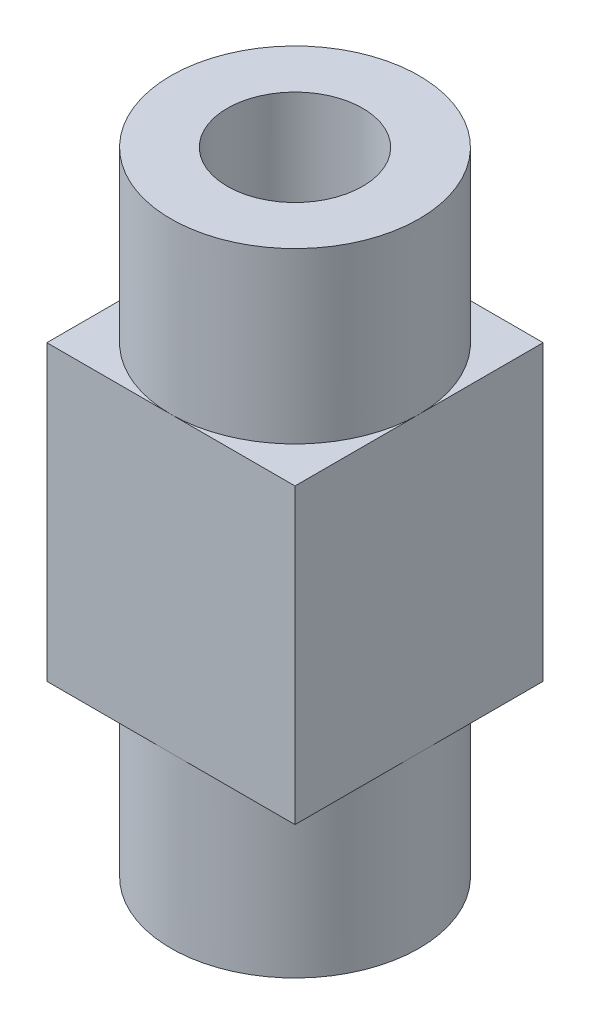
ISO-10303-21;
HEADER;
FILE_DESCRIPTION(('STEP AP214'),'2;1');
FILE_NAME('part.step','',(''),(''),'','','');
FILE_SCHEMA(('AUTOMOTIVE_DESIGN { 1 0 10303 214 1 1 1 1 }'));
ENDSEC;
DATA;
#1=APPLICATION_CONTEXT('core data for automotive mechanical design processes');
#2=APPLICATION_PROTOCOL_DEFINITION('international standard','automotive_design',2000,#1);
#3=PRODUCT_CONTEXT('',#1,'mechanical');
#4=PRODUCT('Part','Part','',(#3));
#5=PRODUCT_RELATED_PRODUCT_CATEGORY('part','',(#4));
#6=PRODUCT_DEFINITION_FORMATION('','',#4);
#7=PRODUCT_DEFINITION_CONTEXT('part definition',#1,'design');
#8=PRODUCT_DEFINITION('design','',#6,#7);
#9=PRODUCT_DEFINITION_SHAPE('','',#8);
#10=(LENGTH_UNIT() NAMED_UNIT(*) SI_UNIT(.MILLI.,.METRE.));
#11=(NAMED_UNIT(*) PLANE_ANGLE_UNIT() SI_UNIT($,.RADIAN.));
#12=(NAMED_UNIT(*) SI_UNIT($,.STERADIAN.) SOLID_ANGLE_UNIT());
#13=UNCERTAINTY_MEASURE_WITH_UNIT(LENGTH_MEASURE(1.E-05),#10,'distance_accuracy_value','');
#14=(GEOMETRIC_REPRESENTATION_CONTEXT(3) GLOBAL_UNCERTAINTY_ASSIGNED_CONTEXT((#13)) GLOBAL_UNIT_ASSIGNED_CONTEXT((#10,
#11,#12)) REPRESENTATION_CONTEXT('',''));
#15=CARTESIAN_POINT('',(0.,0.,0.));
#16=DIRECTION('',(0.,0.,1.));
#17=DIRECTION('',(1.,0.,0.));
#18=AXIS2_PLACEMENT_3D('',#15,#16,#17);
#19=CARTESIAN_POINT('',(-11.,41.,-11.));
#20=DIRECTION('',(0.,1.,0.));
#21=DIRECTION('',(0.,0.,1.));
#22=AXIS2_PLACEMENT_3D('',#19,#20,#21);
#23=PLANE('',#22);
#24=DIRECTION('',(0.,0.,-1.));
#25=VECTOR('',#24,1.);
#26=CARTESIAN_POINT('',(11.,41.,11.));
#27=LINE('',#26,#25);
#28=CARTESIAN_POINT('',(11.,41.,11.));
#29=VERTEX_POINT('',#28);
#30=CARTESIAN_POINT('',(11.,41.,0.));
#31=VERTEX_POINT('',#30);
#32=EDGE_CURVE('E142',#29,#31,#27,.T.);
#33=ORIENTED_EDGE('',*,*,#32,.T.);
#34=CARTESIAN_POINT('',(0.,41.,0.));
#35=DIRECTION('',(0.,-1.,0.));
#36=DIRECTION('',(1.,0.,0.));
#37=AXIS2_PLACEMENT_3D('',#34,#35,#36);
#38=CIRCLE('',#37,11.);
#39=CARTESIAN_POINT('',(0.,41.,11.));
#40=VERTEX_POINT('',#39);
#41=EDGE_CURVE('E79',#31,#40,#38,.T.);
#42=ORIENTED_EDGE('',*,*,#41,.T.);
#43=DIRECTION('',(1.,0.,0.));
#44=VECTOR('',#43,1.);
#45=CARTESIAN_POINT('',(-11.,41.,11.));
#46=LINE('',#45,#44);
#47=EDGE_CURVE('E139',#40,#29,#46,.T.);
#48=ORIENTED_EDGE('',*,*,#47,.T.);
#49=EDGE_LOOP('',(#33,#42,#48));
#50=FACE_BOUND('',#49,.T.);
#51=ADVANCED_FACE('F63',(#50),#23,.T.);
#52=CARTESIAN_POINT('',(-11.,41.,11.));
#53=VERTEX_POINT('',#52);
#54=EDGE_CURVE('E151',#53,#40,#46,.T.);
#55=ORIENTED_EDGE('',*,*,#54,.T.);
#56=CARTESIAN_POINT('',(-11.,41.,0.));
#57=VERTEX_POINT('',#56);
#58=EDGE_CURVE('E127',#40,#57,#38,.T.);
#59=ORIENTED_EDGE('',*,*,#58,.T.);
#60=DIRECTION('',(0.,0.,1.));
#61=VECTOR('',#60,1.);
#62=CARTESIAN_POINT('',(-11.,41.,-11.));
#63=LINE('',#62,#61);
#64=EDGE_CURVE('E156',#57,#53,#63,.T.);
#65=ORIENTED_EDGE('',*,*,#64,.T.);
#66=EDGE_LOOP('',(#55,#59,#65));
#67=FACE_BOUND('',#66,.T.);
#68=ADVANCED_FACE('F155',(#67),#23,.T.);
#69=CARTESIAN_POINT('',(-11.,41.,-11.));
#70=VERTEX_POINT('',#69);
#71=EDGE_CURVE('E153',#70,#57,#63,.T.);
#72=ORIENTED_EDGE('',*,*,#71,.T.);
#73=CARTESIAN_POINT('',(0.,41.,-11.));
#74=VERTEX_POINT('',#73);
#75=EDGE_CURVE('E130',#57,#74,#38,.T.);
#76=ORIENTED_EDGE('',*,*,#75,.T.);
#77=DIRECTION('',(-1.,0.,0.));
#78=VECTOR('',#77,1.);
#79=CARTESIAN_POINT('',(11.,41.,-11.));
#80=LINE('',#79,#78);
#81=EDGE_CURVE('E162',#74,#70,#80,.T.);
#82=ORIENTED_EDGE('',*,*,#81,.T.);
#83=EDGE_LOOP('',(#72,#76,#82));
#84=FACE_BOUND('',#83,.T.);
#85=ADVANCED_FACE('F259',(#84),#23,.T.);
#86=CARTESIAN_POINT('',(11.,41.,-11.));
#87=VERTEX_POINT('',#86);
#88=EDGE_CURVE('E163',#87,#74,#80,.T.);
#89=ORIENTED_EDGE('',*,*,#88,.T.);
#90=EDGE_CURVE('E146',#74,#31,#38,.T.);
#91=ORIENTED_EDGE('',*,*,#90,.T.);
#92=EDGE_CURVE('E158',#31,#87,#27,.T.);
#93=ORIENTED_EDGE('',*,*,#92,.T.);
#94=EDGE_LOOP('',(#89,#91,#93));
#95=FACE_BOUND('',#94,.T.);
#96=ADVANCED_FACE('F255',(#95),#23,.T.);
#97=CARTESIAN_POINT('',(0.,15.,0.));
#98=DIRECTION('',(0.,-1.,0.));
#99=DIRECTION('',(0.,0.,-1.));
#100=AXIS2_PLACEMENT_3D('',#97,#98,#99);
#101=CYLINDRICAL_SURFACE('',#100,11.);
#102=CARTESIAN_POINT('',(0.,15.,0.));
#103=DIRECTION('',(0.,-1.,0.));
#104=DIRECTION('',(1.,0.,0.));
#105=AXIS2_PLACEMENT_3D('',#102,#103,#104);
#106=CIRCLE('',#105,11.);
#107=CARTESIAN_POINT('',(11.,15.,0.));
#108=VERTEX_POINT('',#107);
#109=CARTESIAN_POINT('',(0.,15.,11.));
#110=VERTEX_POINT('',#109);
#111=EDGE_CURVE('E194',#108,#110,#106,.T.);
#112=ORIENTED_EDGE('',*,*,#111,.T.);
#113=CARTESIAN_POINT('',(-11.,15.,0.));
#114=VERTEX_POINT('',#113);
#115=EDGE_CURVE('E196',#110,#114,#106,.T.);
#116=ORIENTED_EDGE('',*,*,#115,.T.);
#117=CARTESIAN_POINT('',(0.,15.,-11.));
#118=VERTEX_POINT('',#117);
#119=EDGE_CURVE('E204',#114,#118,#106,.T.);
#120=ORIENTED_EDGE('',*,*,#119,.T.);
#121=EDGE_CURVE('E197',#118,#108,#106,.T.);
#122=ORIENTED_EDGE('',*,*,#121,.T.);
#123=EDGE_LOOP('',(#112,#116,#120,#122));
#124=FACE_BOUND('',#123,.T.);
#125=CARTESIAN_POINT('',(0.,0.,0.));
#126=DIRECTION('',(0.,-1.,0.));
#127=DIRECTION('',(1.,0.,0.));
#128=AXIS2_PLACEMENT_3D('',#125,#126,#127);
#129=CIRCLE('',#128,11.);
#130=CARTESIAN_POINT('',(11.,0.,0.));
#131=VERTEX_POINT('',#130);
#132=EDGE_CURVE('E193',#131,#131,#129,.T.);
#133=ORIENTED_EDGE('',*,*,#132,.F.);
#134=EDGE_LOOP('',(#133));
#135=FACE_BOUND('',#134,.T.);
#136=ADVANCED_FACE('F65',(#124,#135),#101,.T.);
#137=CARTESIAN_POINT('',(0.,0.,0.));
#138=DIRECTION('',(0.,-1.,0.));
#139=DIRECTION('',(0.,0.,-1.));
#140=AXIS2_PLACEMENT_3D('',#137,#138,#139);
#141=PLANE('',#140);
#142=ORIENTED_EDGE('',*,*,#132,.T.);
#143=EDGE_LOOP('',(#142));
#144=FACE_BOUND('',#143,.T.);
#145=CARTESIAN_POINT('',(0.,0.,0.));
#146=DIRECTION('',(0.,-1.,0.));
#147=DIRECTION('',(0.,0.,-1.));
#148=AXIS2_PLACEMENT_3D('',#145,#146,#147);
#149=CIRCLE('',#148,6.);
#150=CARTESIAN_POINT('',(0.,0.,-6.));
#151=VERTEX_POINT('',#150);
#152=EDGE_CURVE('E145',#151,#151,#149,.F.);
#153=ORIENTED_EDGE('',*,*,#152,.T.);
#154=EDGE_LOOP('',(#153));
#155=FACE_BOUND('',#154,.T.);
#156=ADVANCED_FACE('F268',(#144,#155),#141,.T.);
#157=CARTESIAN_POINT('',(-11.,15.,-11.));
#158=DIRECTION('',(0.,1.,0.));
#159=DIRECTION('',(0.,0.,1.));
#160=AXIS2_PLACEMENT_3D('',#157,#158,#159);
#161=PLANE('',#160);
#162=ORIENTED_EDGE('',*,*,#111,.F.);
#163=DIRECTION('',(0.,0.,-1.));
#164=VECTOR('',#163,1.);
#165=CARTESIAN_POINT('',(11.,15.,0.));
#166=LINE('',#165,#164);
#167=CARTESIAN_POINT('',(11.,15.,11.));
#168=VERTEX_POINT('',#167);
#169=EDGE_CURVE('E87',#168,#108,#166,.T.);
#170=ORIENTED_EDGE('',*,*,#169,.F.);
#171=DIRECTION('',(1.,0.,0.));
#172=VECTOR('',#171,1.);
#173=CARTESIAN_POINT('',(0.,15.,11.));
#174=LINE('',#173,#172);
#175=EDGE_CURVE('E171',#110,#168,#174,.T.);
#176=ORIENTED_EDGE('',*,*,#175,.F.);
#177=EDGE_LOOP('',(#162,#170,#176));
#178=FACE_BOUND('',#177,.T.);
#179=ADVANCED_FACE('F217',(#178),#161,.F.);
#180=ORIENTED_EDGE('',*,*,#115,.F.);
#181=CARTESIAN_POINT('',(-11.,15.,11.));
#182=VERTEX_POINT('',#181);
#183=EDGE_CURVE('E173',#182,#110,#174,.T.);
#184=ORIENTED_EDGE('',*,*,#183,.F.);
#185=DIRECTION('',(0.,0.,1.));
#186=VECTOR('',#185,1.);
#187=CARTESIAN_POINT('',(-11.,15.,0.));
#188=LINE('',#187,#186);
#189=EDGE_CURVE('E172',#114,#182,#188,.T.);
#190=ORIENTED_EDGE('',*,*,#189,.F.);
#191=EDGE_LOOP('',(#180,#184,#190));
#192=FACE_BOUND('',#191,.T.);
#193=ADVANCED_FACE('F214',(#192),#161,.F.);
#194=ORIENTED_EDGE('',*,*,#119,.F.);
#195=CARTESIAN_POINT('',(-11.,15.,-11.));
#196=VERTEX_POINT('',#195);
#197=EDGE_CURVE('E167',#196,#114,#188,.T.);
#198=ORIENTED_EDGE('',*,*,#197,.F.);
#199=DIRECTION('',(-1.,0.,0.));
#200=VECTOR('',#199,1.);
#201=CARTESIAN_POINT('',(11.,15.,-11.));
#202=LINE('',#201,#200);
#203=EDGE_CURVE('E180',#118,#196,#202,.T.);
#204=ORIENTED_EDGE('',*,*,#203,.F.);
#205=EDGE_LOOP('',(#194,#198,#204));
#206=FACE_BOUND('',#205,.T.);
#207=ADVANCED_FACE('F297',(#206),#161,.F.);
#208=CARTESIAN_POINT('',(-11.,41.,0.));
#209=DIRECTION('',(1.,0.,0.));
#210=DIRECTION('',(0.,0.,-1.));
#211=AXIS2_PLACEMENT_3D('',#208,#209,#210);
#212=PLANE('',#211);
#213=ORIENTED_EDGE('',*,*,#197,.T.);
#214=ORIENTED_EDGE('',*,*,#189,.T.);
#215=DIRECTION('',(0.,-1.,0.));
#216=VECTOR('',#215,1.);
#217=CARTESIAN_POINT('',(-11.,41.,11.));
#218=LINE('',#217,#216);
#219=EDGE_CURVE('E188',#53,#182,#218,.T.);
#220=ORIENTED_EDGE('',*,*,#219,.F.);
#221=ORIENTED_EDGE('',*,*,#64,.F.);
#222=ORIENTED_EDGE('',*,*,#71,.F.);
#223=DIRECTION('',(0.,-1.,0.));
#224=VECTOR('',#223,1.);
#225=CARTESIAN_POINT('',(-11.,41.,-11.));
#226=LINE('',#225,#224);
#227=EDGE_CURVE('E190',#70,#196,#226,.T.);
#228=ORIENTED_EDGE('',*,*,#227,.T.);
#229=EDGE_LOOP('',(#213,#214,#220,#221,#222,#228));
#230=FACE_BOUND('',#229,.T.);
#231=ADVANCED_FACE('F220',(#230),#212,.F.);
#232=CARTESIAN_POINT('',(0.,41.,11.));
#233=DIRECTION('',(0.,0.,-1.));
#234=DIRECTION('',(-1.,0.,0.));
#235=AXIS2_PLACEMENT_3D('',#232,#233,#234);
#236=PLANE('',#235);
#237=ORIENTED_EDGE('',*,*,#175,.T.);
#238=DIRECTION('',(0.,-1.,0.));
#239=VECTOR('',#238,1.);
#240=CARTESIAN_POINT('',(11.,41.,11.));
#241=LINE('',#240,#239);
#242=EDGE_CURVE('E152',#29,#168,#241,.T.);
#243=ORIENTED_EDGE('',*,*,#242,.F.);
#244=ORIENTED_EDGE('',*,*,#47,.F.);
#245=ORIENTED_EDGE('',*,*,#54,.F.);
#246=ORIENTED_EDGE('',*,*,#219,.T.);
#247=ORIENTED_EDGE('',*,*,#183,.T.);
#248=EDGE_LOOP('',(#237,#243,#244,#245,#246,#247));
#249=FACE_BOUND('',#248,.T.);
#250=ADVANCED_FACE('F150',(#249),#236,.F.);
#251=CARTESIAN_POINT('',(11.,41.,0.));
#252=DIRECTION('',(-1.,0.,0.));
#253=DIRECTION('',(0.,0.,1.));
#254=AXIS2_PLACEMENT_3D('',#251,#252,#253);
#255=PLANE('',#254);
#256=ORIENTED_EDGE('',*,*,#169,.T.);
#257=CARTESIAN_POINT('',(11.,15.,-11.));
#258=VERTEX_POINT('',#257);
#259=EDGE_CURVE('E177',#108,#258,#166,.T.);
#260=ORIENTED_EDGE('',*,*,#259,.T.);
#261=DIRECTION('',(0.,-1.,0.));
#262=VECTOR('',#261,1.);
#263=CARTESIAN_POINT('',(11.,41.,-11.));
#264=LINE('',#263,#262);
#265=EDGE_CURVE('E166',#87,#258,#264,.T.);
#266=ORIENTED_EDGE('',*,*,#265,.F.);
#267=ORIENTED_EDGE('',*,*,#92,.F.);
#268=ORIENTED_EDGE('',*,*,#32,.F.);
#269=ORIENTED_EDGE('',*,*,#242,.T.);
#270=EDGE_LOOP('',(#256,#260,#266,#267,#268,#269));
#271=FACE_BOUND('',#270,.T.);
#272=ADVANCED_FACE('F293',(#271),#255,.F.);
#273=CARTESIAN_POINT('',(11.,41.,-11.));
#274=DIRECTION('',(0.,0.,1.));
#275=DIRECTION('',(1.,0.,0.));
#276=AXIS2_PLACEMENT_3D('',#273,#274,#275);
#277=PLANE('',#276);
#278=EDGE_CURVE('E181',#258,#118,#202,.T.);
#279=ORIENTED_EDGE('',*,*,#278,.T.);
#280=ORIENTED_EDGE('',*,*,#203,.T.);
#281=ORIENTED_EDGE('',*,*,#227,.F.);
#282=ORIENTED_EDGE('',*,*,#81,.F.);
#283=ORIENTED_EDGE('',*,*,#88,.F.);
#284=ORIENTED_EDGE('',*,*,#265,.T.);
#285=EDGE_LOOP('',(#279,#280,#281,#282,#283,#284));
#286=FACE_BOUND('',#285,.T.);
#287=ADVANCED_FACE('F275',(#286),#277,.F.);
#288=ORIENTED_EDGE('',*,*,#121,.F.);
#289=ORIENTED_EDGE('',*,*,#278,.F.);
#290=ORIENTED_EDGE('',*,*,#259,.F.);
#291=EDGE_LOOP('',(#288,#289,#290));
#292=FACE_BOUND('',#291,.T.);
#293=ADVANCED_FACE('F250',(#292),#161,.F.);
#294=CARTESIAN_POINT('',(0.,56.,0.));
#295=DIRECTION('',(0.,-1.,0.));
#296=DIRECTION('',(0.,0.,-1.));
#297=AXIS2_PLACEMENT_3D('',#294,#295,#296);
#298=CYLINDRICAL_SURFACE('',#297,11.);
#299=CARTESIAN_POINT('',(0.,56.,0.));
#300=DIRECTION('',(0.,-1.,0.));
#301=DIRECTION('',(-1.,0.,0.));
#302=AXIS2_PLACEMENT_3D('',#299,#300,#301);
#303=CIRCLE('',#302,11.);
#304=CARTESIAN_POINT('',(-11.,56.,0.));
#305=VERTEX_POINT('',#304);
#306=EDGE_CURVE('E144',#305,#305,#303,.T.);
#307=ORIENTED_EDGE('',*,*,#306,.T.);
#308=EDGE_LOOP('',(#307));
#309=FACE_BOUND('',#308,.T.);
#310=ORIENTED_EDGE('',*,*,#41,.F.);
#311=ORIENTED_EDGE('',*,*,#90,.F.);
#312=ORIENTED_EDGE('',*,*,#75,.F.);
#313=ORIENTED_EDGE('',*,*,#58,.F.);
#314=EDGE_LOOP('',(#310,#311,#312,#313));
#315=FACE_BOUND('',#314,.T.);
#316=ADVANCED_FACE('F128',(#309,#315),#298,.T.);
#317=CARTESIAN_POINT('',(0.,56.,0.));
#318=DIRECTION('',(0.,-1.,0.));
#319=DIRECTION('',(0.,0.,-1.));
#320=AXIS2_PLACEMENT_3D('',#317,#318,#319);
#321=PLANE('',#320);
#322=ORIENTED_EDGE('',*,*,#306,.F.);
#323=EDGE_LOOP('',(#322));
#324=FACE_BOUND('',#323,.T.);
#325=CARTESIAN_POINT('',(0.,56.,0.));
#326=DIRECTION('',(0.,1.,0.));
#327=DIRECTION('',(0.,0.,1.));
#328=AXIS2_PLACEMENT_3D('',#325,#326,#327);
#329=CIRCLE('',#328,6.);
#330=CARTESIAN_POINT('',(0.,56.,6.));
#331=VERTEX_POINT('',#330);
#332=EDGE_CURVE('E231',#331,#331,#329,.T.);
#333=ORIENTED_EDGE('',*,*,#332,.F.);
#334=EDGE_LOOP('',(#333));
#335=FACE_BOUND('',#334,.T.);
#336=ADVANCED_FACE('F238',(#324,#335),#321,.F.);
#337=CARTESIAN_POINT('',(0.,-21.1424927574778,0.));
#338=DIRECTION('',(0.,1.,0.));
#339=DIRECTION('',(0.,0.,1.));
#340=AXIS2_PLACEMENT_3D('',#337,#338,#339);
#341=CYLINDRICAL_SURFACE('',#340,6.);
#342=ORIENTED_EDGE('',*,*,#332,.T.);
#343=EDGE_LOOP('',(#342));
#344=FACE_BOUND('',#343,.T.);
#345=CARTESIAN_POINT('',(0.,41.,0.));
#346=DIRECTION('',(0.,-1.,0.));
#347=DIRECTION('',(0.,0.,-1.));
#348=AXIS2_PLACEMENT_3D('',#345,#346,#347);
#349=CIRCLE('',#348,6.);
#350=CARTESIAN_POINT('',(0.,41.,-6.));
#351=VERTEX_POINT('',#350);
#352=EDGE_CURVE('E67',#351,#351,#349,.T.);
#353=ORIENTED_EDGE('',*,*,#352,.T.);
#354=EDGE_LOOP('',(#353));
#355=FACE_BOUND('',#354,.T.);
#356=ADVANCED_FACE('F235',(#344,#355),#341,.F.);
#357=CARTESIAN_POINT('',(0.,41.,0.));
#358=DIRECTION('',(0.,-1.,0.));
#359=DIRECTION('',(0.,0.,-1.));
#360=AXIS2_PLACEMENT_3D('',#357,#358,#359);
#361=PLANE('',#360);
#362=ORIENTED_EDGE('',*,*,#352,.F.);
#363=EDGE_LOOP('',(#362));
#364=FACE_BOUND('',#363,.T.);
#365=ADVANCED_FACE('F246',(#364),#361,.F.);
#366=ORIENTED_EDGE('',*,*,#152,.F.);
#367=EDGE_LOOP('',(#366));
#368=FACE_BOUND('',#367,.T.);
#369=CARTESIAN_POINT('',(0.,15.,0.));
#370=DIRECTION('',(0.,1.,0.));
#371=DIRECTION('',(0.,0.,1.));
#372=AXIS2_PLACEMENT_3D('',#369,#370,#371);
#373=CIRCLE('',#372,6.);
#374=CARTESIAN_POINT('',(0.,15.,6.));
#375=VERTEX_POINT('',#374);
#376=EDGE_CURVE('E11',#375,#375,#373,.T.);
#377=ORIENTED_EDGE('',*,*,#376,.T.);
#378=EDGE_LOOP('',(#377));
#379=FACE_BOUND('',#378,.T.);
#380=ADVANCED_FACE('F248',(#368,#379),#341,.F.);
#381=CARTESIAN_POINT('',(0.,15.,0.));
#382=DIRECTION('',(0.,1.,0.));
#383=DIRECTION('',(0.,0.,1.));
#384=AXIS2_PLACEMENT_3D('',#381,#382,#383);
#385=PLANE('',#384);
#386=ORIENTED_EDGE('',*,*,#376,.F.);
#387=EDGE_LOOP('',(#386));
#388=FACE_BOUND('',#387,.T.);
#389=ADVANCED_FACE('F376',(#388),#385,.F.);
#390=CLOSED_SHELL('',(#51,#68,#85,#96,#136,#156,#179,#193,#207,#231,#250,#272,#287,#293,#316,
#336,#356,#365,#380,#389));
#391=MANIFOLD_SOLID_BREP('B2',#390);
#392=ADVANCED_BREP_SHAPE_REPRESENTATION('',(#18,#391),#14);
#393=SHAPE_DEFINITION_REPRESENTATION(#9,#392);
ENDSEC;
END-ISO-10303-21;
